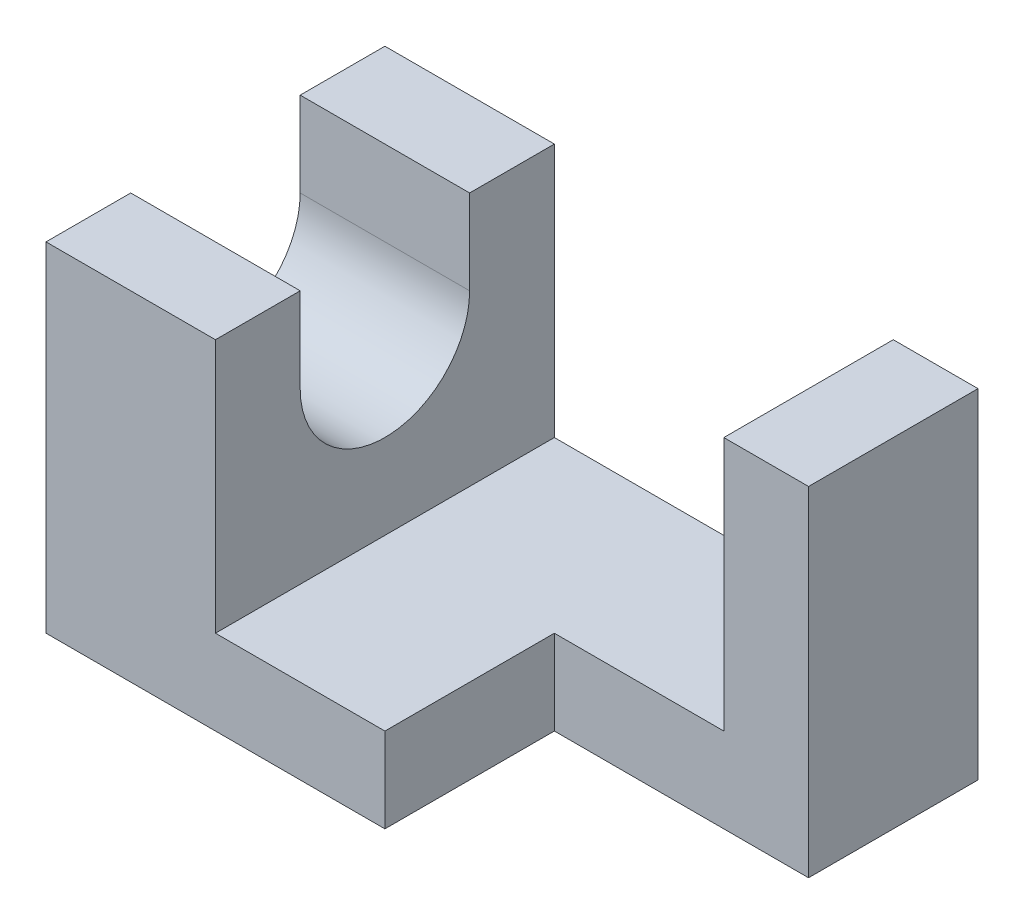
ISO-10303-21;
HEADER;
FILE_DESCRIPTION(('STEP AP214'),'2;1');
FILE_NAME('part.step','',(''),(''),'','','');
FILE_SCHEMA(('AUTOMOTIVE_DESIGN { 1 0 10303 214 1 1 1 1 }'));
ENDSEC;
DATA;
#1=APPLICATION_CONTEXT('core data for automotive mechanical design processes');
#2=APPLICATION_PROTOCOL_DEFINITION('international standard','automotive_design',2000,#1);
#3=PRODUCT_CONTEXT('',#1,'mechanical');
#4=PRODUCT('Part','Part','',(#3));
#5=PRODUCT_RELATED_PRODUCT_CATEGORY('part','',(#4));
#6=PRODUCT_DEFINITION_FORMATION('','',#4);
#7=PRODUCT_DEFINITION_CONTEXT('part definition',#1,'design');
#8=PRODUCT_DEFINITION('design','',#6,#7);
#9=PRODUCT_DEFINITION_SHAPE('','',#8);
#10=(LENGTH_UNIT() NAMED_UNIT(*) SI_UNIT(.MILLI.,.METRE.));
#11=(NAMED_UNIT(*) PLANE_ANGLE_UNIT() SI_UNIT($,.RADIAN.));
#12=(NAMED_UNIT(*) SI_UNIT($,.STERADIAN.) SOLID_ANGLE_UNIT());
#13=UNCERTAINTY_MEASURE_WITH_UNIT(LENGTH_MEASURE(1.E-05),#10,'distance_accuracy_value','');
#14=(GEOMETRIC_REPRESENTATION_CONTEXT(3) GLOBAL_UNCERTAINTY_ASSIGNED_CONTEXT((#13)) GLOBAL_UNIT_ASSIGNED_CONTEXT((#10,
#11,#12)) REPRESENTATION_CONTEXT('',''));
#15=CARTESIAN_POINT('',(0.,0.,0.));
#16=DIRECTION('',(0.,0.,1.));
#17=DIRECTION('',(1.,0.,0.));
#18=AXIS2_PLACEMENT_3D('',#15,#16,#17);
#19=CARTESIAN_POINT('',(0.,40.,-40.));
#20=DIRECTION('',(0.,1.,0.));
#21=DIRECTION('',(0.,0.,1.));
#22=AXIS2_PLACEMENT_3D('',#19,#20,#21);
#23=PLANE('',#22);
#24=DIRECTION('',(-1.,0.,0.));
#25=VECTOR('',#24,1.);
#26=CARTESIAN_POINT('',(40.,40.,-10.));
#27=LINE('',#26,#25);
#28=CARTESIAN_POINT('',(20.,40.,-10.));
#29=VERTEX_POINT('',#28);
#30=CARTESIAN_POINT('',(0.,40.,-10.));
#31=VERTEX_POINT('',#30);
#32=EDGE_CURVE('E186',#29,#31,#27,.T.);
#33=ORIENTED_EDGE('',*,*,#32,.T.);
#34=DIRECTION('',(0.,0.,1.));
#35=VECTOR('',#34,1.);
#36=CARTESIAN_POINT('',(0.,40.,-40.));
#37=LINE('',#36,#35);
#38=CARTESIAN_POINT('',(0.,40.,0.));
#39=VERTEX_POINT('',#38);
#40=EDGE_CURVE('E158',#31,#39,#37,.T.);
#41=ORIENTED_EDGE('',*,*,#40,.T.);
#42=DIRECTION('',(-1.,0.,0.));
#43=VECTOR('',#42,1.);
#44=CARTESIAN_POINT('',(0.,40.,0.));
#45=LINE('',#44,#43);
#46=CARTESIAN_POINT('',(20.,40.,0.));
#47=VERTEX_POINT('',#46);
#48=EDGE_CURVE('E165',#47,#39,#45,.T.);
#49=ORIENTED_EDGE('',*,*,#48,.F.);
#50=DIRECTION('',(0.,0.,1.));
#51=VECTOR('',#50,1.);
#52=CARTESIAN_POINT('',(20.,40.,-40.));
#53=LINE('',#52,#51);
#54=EDGE_CURVE('E228',#29,#47,#53,.T.);
#55=ORIENTED_EDGE('',*,*,#54,.F.);
#56=EDGE_LOOP('',(#33,#41,#49,#55));
#57=FACE_BOUND('',#56,.T.);
#58=ADVANCED_FACE('F33',(#57),#23,.T.);
#59=DIRECTION('',(-1.,0.,0.));
#60=VECTOR('',#59,1.);
#61=CARTESIAN_POINT('',(40.,40.,-30.));
#62=LINE('',#61,#60);
#63=CARTESIAN_POINT('',(20.,40.,-30.));
#64=VERTEX_POINT('',#63);
#65=CARTESIAN_POINT('',(0.,40.,-30.));
#66=VERTEX_POINT('',#65);
#67=EDGE_CURVE('E132',#64,#66,#62,.T.);
#68=ORIENTED_EDGE('',*,*,#67,.F.);
#69=CARTESIAN_POINT('',(20.,40.,-40.));
#70=VERTEX_POINT('',#69);
#71=EDGE_CURVE('E225',#70,#64,#53,.T.);
#72=ORIENTED_EDGE('',*,*,#71,.F.);
#73=DIRECTION('',(-1.,0.,0.));
#74=VECTOR('',#73,1.);
#75=CARTESIAN_POINT('',(0.,40.,-40.));
#76=LINE('',#75,#74);
#77=CARTESIAN_POINT('',(0.,40.,-40.));
#78=VERTEX_POINT('',#77);
#79=EDGE_CURVE('E156',#70,#78,#76,.T.);
#80=ORIENTED_EDGE('',*,*,#79,.T.);
#81=EDGE_CURVE('E149',#78,#66,#37,.T.);
#82=ORIENTED_EDGE('',*,*,#81,.T.);
#83=EDGE_LOOP('',(#68,#72,#80,#82));
#84=FACE_BOUND('',#83,.T.);
#85=ADVANCED_FACE('F154',(#84),#23,.T.);
#86=CARTESIAN_POINT('',(0.,0.,-40.));
#87=DIRECTION('',(-1.,0.,0.));
#88=DIRECTION('',(0.,-1.,0.));
#89=AXIS2_PLACEMENT_3D('',#86,#87,#88);
#90=PLANE('',#89);
#91=DIRECTION('',(0.,1.,0.));
#92=VECTOR('',#91,1.);
#93=CARTESIAN_POINT('',(0.,30.,-10.));
#94=LINE('',#93,#92);
#95=CARTESIAN_POINT('',(0.,30.,-10.));
#96=VERTEX_POINT('',#95);
#97=EDGE_CURVE('E143',#96,#31,#94,.T.);
#98=ORIENTED_EDGE('',*,*,#97,.F.);
#99=CARTESIAN_POINT('',(0.,30.,-20.));
#100=DIRECTION('',(-1.,0.,0.));
#101=DIRECTION('',(0.,-1.,0.));
#102=AXIS2_PLACEMENT_3D('',#99,#100,#101);
#103=CIRCLE('',#102,10.);
#104=CARTESIAN_POINT('',(0.,30.,-30.));
#105=VERTEX_POINT('',#104);
#106=EDGE_CURVE('E152',#105,#96,#103,.T.);
#107=ORIENTED_EDGE('',*,*,#106,.F.);
#108=DIRECTION('',(0.,-1.,0.));
#109=VECTOR('',#108,1.);
#110=CARTESIAN_POINT('',(0.,40.,-30.));
#111=LINE('',#110,#109);
#112=EDGE_CURVE('E135',#66,#105,#111,.T.);
#113=ORIENTED_EDGE('',*,*,#112,.F.);
#114=ORIENTED_EDGE('',*,*,#81,.F.);
#115=DIRECTION('',(0.,-1.,0.));
#116=VECTOR('',#115,1.);
#117=CARTESIAN_POINT('',(0.,0.,-40.));
#118=LINE('',#117,#116);
#119=CARTESIAN_POINT('',(0.,0.,-40.));
#120=VERTEX_POINT('',#119);
#121=EDGE_CURVE('E237',#78,#120,#118,.T.);
#122=ORIENTED_EDGE('',*,*,#121,.T.);
#123=DIRECTION('',(0.,0.,1.));
#124=VECTOR('',#123,1.);
#125=CARTESIAN_POINT('',(0.,0.,-40.));
#126=LINE('',#125,#124);
#127=CARTESIAN_POINT('',(0.,0.,0.));
#128=VERTEX_POINT('',#127);
#129=EDGE_CURVE('E172',#120,#128,#126,.T.);
#130=ORIENTED_EDGE('',*,*,#129,.T.);
#131=DIRECTION('',(0.,-1.,0.));
#132=VECTOR('',#131,1.);
#133=CARTESIAN_POINT('',(0.,0.,0.));
#134=LINE('',#133,#132);
#135=EDGE_CURVE('E227',#39,#128,#134,.T.);
#136=ORIENTED_EDGE('',*,*,#135,.F.);
#137=ORIENTED_EDGE('',*,*,#40,.F.);
#138=EDGE_LOOP('',(#98,#107,#113,#114,#122,#130,#136,#137));
#139=FACE_BOUND('',#138,.T.);
#140=ADVANCED_FACE('F35',(#139),#90,.T.);
#141=DIRECTION('',(-1.,0.,0.));
#142=VECTOR('',#141,1.);
#143=CARTESIAN_POINT('',(70.,40.,-20.));
#144=LINE('',#143,#142);
#145=CARTESIAN_POINT('',(70.,40.,-20.));
#146=VERTEX_POINT('',#145);
#147=CARTESIAN_POINT('',(60.,40.,-20.));
#148=VERTEX_POINT('',#147);
#149=EDGE_CURVE('E189',#146,#148,#144,.T.);
#150=ORIENTED_EDGE('',*,*,#149,.F.);
#151=DIRECTION('',(0.,0.,1.));
#152=VECTOR('',#151,1.);
#153=CARTESIAN_POINT('',(70.,40.,-40.));
#154=LINE('',#153,#152);
#155=CARTESIAN_POINT('',(70.,40.,-40.));
#156=VERTEX_POINT('',#155);
#157=EDGE_CURVE('E162',#156,#146,#154,.T.);
#158=ORIENTED_EDGE('',*,*,#157,.F.);
#159=CARTESIAN_POINT('',(60.,40.,-40.));
#160=VERTEX_POINT('',#159);
#161=EDGE_CURVE('E173',#156,#160,#76,.T.);
#162=ORIENTED_EDGE('',*,*,#161,.T.);
#163=DIRECTION('',(0.,0.,1.));
#164=VECTOR('',#163,1.);
#165=CARTESIAN_POINT('',(60.,40.,-40.));
#166=LINE('',#165,#164);
#167=EDGE_CURVE('E229',#160,#148,#166,.T.);
#168=ORIENTED_EDGE('',*,*,#167,.T.);
#169=EDGE_LOOP('',(#150,#158,#162,#168));
#170=FACE_BOUND('',#169,.T.);
#171=ADVANCED_FACE('F282',(#170),#23,.T.);
#172=CARTESIAN_POINT('',(70.,0.,-40.));
#173=DIRECTION('',(1.,0.,0.));
#174=DIRECTION('',(0.,1.,0.));
#175=AXIS2_PLACEMENT_3D('',#172,#173,#174);
#176=PLANE('',#175);
#177=DIRECTION('',(0.,1.,0.));
#178=VECTOR('',#177,1.);
#179=CARTESIAN_POINT('',(70.,0.,-20.));
#180=LINE('',#179,#178);
#181=CARTESIAN_POINT('',(70.,0.,-20.));
#182=VERTEX_POINT('',#181);
#183=EDGE_CURVE('E200',#182,#146,#180,.T.);
#184=ORIENTED_EDGE('',*,*,#183,.F.);
#185=DIRECTION('',(0.,0.,1.));
#186=VECTOR('',#185,1.);
#187=CARTESIAN_POINT('',(70.,0.,-40.));
#188=LINE('',#187,#186);
#189=CARTESIAN_POINT('',(70.,0.,-40.));
#190=VERTEX_POINT('',#189);
#191=EDGE_CURVE('E169',#190,#182,#188,.T.);
#192=ORIENTED_EDGE('',*,*,#191,.F.);
#193=DIRECTION('',(0.,1.,0.));
#194=VECTOR('',#193,1.);
#195=CARTESIAN_POINT('',(70.,0.,-40.));
#196=LINE('',#195,#194);
#197=EDGE_CURVE('E242',#190,#156,#196,.T.);
#198=ORIENTED_EDGE('',*,*,#197,.T.);
#199=ORIENTED_EDGE('',*,*,#157,.T.);
#200=EDGE_LOOP('',(#184,#192,#198,#199));
#201=FACE_BOUND('',#200,.T.);
#202=ADVANCED_FACE('F289',(#201),#176,.T.);
#203=CARTESIAN_POINT('',(0.,0.,-40.));
#204=DIRECTION('',(0.,-1.,0.));
#205=DIRECTION('',(0.,0.,-1.));
#206=AXIS2_PLACEMENT_3D('',#203,#204,#205);
#207=PLANE('',#206);
#208=DIRECTION('',(0.,0.,1.));
#209=VECTOR('',#208,1.);
#210=CARTESIAN_POINT('',(40.,0.,0.));
#211=LINE('',#210,#209);
#212=CARTESIAN_POINT('',(40.,0.,-20.));
#213=VERTEX_POINT('',#212);
#214=CARTESIAN_POINT('',(40.,0.,0.));
#215=VERTEX_POINT('',#214);
#216=EDGE_CURVE('E197',#213,#215,#211,.T.);
#217=ORIENTED_EDGE('',*,*,#216,.T.);
#218=DIRECTION('',(1.,0.,0.));
#219=VECTOR('',#218,1.);
#220=CARTESIAN_POINT('',(0.,0.,0.));
#221=LINE('',#220,#219);
#222=EDGE_CURVE('E248',#128,#215,#221,.T.);
#223=ORIENTED_EDGE('',*,*,#222,.F.);
#224=ORIENTED_EDGE('',*,*,#129,.F.);
#225=DIRECTION('',(1.,0.,0.));
#226=VECTOR('',#225,1.);
#227=CARTESIAN_POINT('',(0.,0.,-40.));
#228=LINE('',#227,#226);
#229=EDGE_CURVE('E239',#120,#190,#228,.T.);
#230=ORIENTED_EDGE('',*,*,#229,.T.);
#231=ORIENTED_EDGE('',*,*,#191,.T.);
#232=DIRECTION('',(-1.,0.,0.));
#233=VECTOR('',#232,1.);
#234=CARTESIAN_POINT('',(70.,0.,-20.));
#235=LINE('',#234,#233);
#236=EDGE_CURVE('E194',#182,#213,#235,.T.);
#237=ORIENTED_EDGE('',*,*,#236,.T.);
#238=EDGE_LOOP('',(#217,#223,#224,#230,#231,#237));
#239=FACE_BOUND('',#238,.T.);
#240=ADVANCED_FACE('F262',(#239),#207,.T.);
#241=CARTESIAN_POINT('',(0.,0.,-40.));
#242=DIRECTION('',(0.,0.,-1.));
#243=DIRECTION('',(-1.,0.,0.));
#244=AXIS2_PLACEMENT_3D('',#241,#242,#243);
#245=PLANE('',#244);
#246=DIRECTION('',(0.,-1.,0.));
#247=VECTOR('',#246,1.);
#248=CARTESIAN_POINT('',(20.,40.,-40.));
#249=LINE('',#248,#247);
#250=CARTESIAN_POINT('',(20.,10.,-40.));
#251=VERTEX_POINT('',#250);
#252=EDGE_CURVE('E211',#70,#251,#249,.T.);
#253=ORIENTED_EDGE('',*,*,#252,.T.);
#254=DIRECTION('',(1.,0.,0.));
#255=VECTOR('',#254,1.);
#256=CARTESIAN_POINT('',(20.,10.,-40.));
#257=LINE('',#256,#255);
#258=CARTESIAN_POINT('',(60.,10.,-40.));
#259=VERTEX_POINT('',#258);
#260=EDGE_CURVE('E214',#251,#259,#257,.T.);
#261=ORIENTED_EDGE('',*,*,#260,.T.);
#262=DIRECTION('',(0.,1.,0.));
#263=VECTOR('',#262,1.);
#264=CARTESIAN_POINT('',(60.,40.,-40.));
#265=LINE('',#264,#263);
#266=EDGE_CURVE('E218',#259,#160,#265,.T.);
#267=ORIENTED_EDGE('',*,*,#266,.T.);
#268=ORIENTED_EDGE('',*,*,#161,.F.);
#269=ORIENTED_EDGE('',*,*,#197,.F.);
#270=ORIENTED_EDGE('',*,*,#229,.F.);
#271=ORIENTED_EDGE('',*,*,#121,.F.);
#272=ORIENTED_EDGE('',*,*,#79,.F.);
#273=EDGE_LOOP('',(#253,#261,#267,#268,#269,#270,#271,#272));
#274=FACE_BOUND('',#273,.T.);
#275=ADVANCED_FACE('F301',(#274),#245,.T.);
#276=CARTESIAN_POINT('',(0.,0.,0.));
#277=DIRECTION('',(0.,0.,-1.));
#278=DIRECTION('',(-1.,0.,0.));
#279=AXIS2_PLACEMENT_3D('',#276,#277,#278);
#280=PLANE('',#279);
#281=ORIENTED_EDGE('',*,*,#222,.T.);
#282=DIRECTION('',(0.,1.,0.));
#283=VECTOR('',#282,1.);
#284=CARTESIAN_POINT('',(40.,0.,0.));
#285=LINE('',#284,#283);
#286=CARTESIAN_POINT('',(40.,10.,0.));
#287=VERTEX_POINT('',#286);
#288=EDGE_CURVE('E202',#215,#287,#285,.T.);
#289=ORIENTED_EDGE('',*,*,#288,.T.);
#290=DIRECTION('',(1.,0.,0.));
#291=VECTOR('',#290,1.);
#292=CARTESIAN_POINT('',(20.,10.,0.));
#293=LINE('',#292,#291);
#294=CARTESIAN_POINT('',(20.,10.,0.));
#295=VERTEX_POINT('',#294);
#296=EDGE_CURVE('E215',#295,#287,#293,.T.);
#297=ORIENTED_EDGE('',*,*,#296,.F.);
#298=DIRECTION('',(0.,-1.,0.));
#299=VECTOR('',#298,1.);
#300=CARTESIAN_POINT('',(20.,40.,0.));
#301=LINE('',#300,#299);
#302=EDGE_CURVE('E210',#47,#295,#301,.T.);
#303=ORIENTED_EDGE('',*,*,#302,.F.);
#304=ORIENTED_EDGE('',*,*,#48,.T.);
#305=ORIENTED_EDGE('',*,*,#135,.T.);
#306=EDGE_LOOP('',(#281,#289,#297,#303,#304,#305));
#307=FACE_BOUND('',#306,.T.);
#308=ADVANCED_FACE('F256',(#307),#280,.F.);
#309=CARTESIAN_POINT('',(20.,40.,-40.));
#310=DIRECTION('',(-1.,0.,0.));
#311=DIRECTION('',(0.,0.,1.));
#312=AXIS2_PLACEMENT_3D('',#309,#310,#311);
#313=PLANE('',#312);
#314=CARTESIAN_POINT('',(20.,30.,-20.));
#315=DIRECTION('',(-1.,0.,0.));
#316=DIRECTION('',(0.,0.,1.));
#317=AXIS2_PLACEMENT_3D('',#314,#315,#316);
#318=CIRCLE('',#317,10.);
#319=CARTESIAN_POINT('',(20.,30.,-30.));
#320=VERTEX_POINT('',#319);
#321=CARTESIAN_POINT('',(20.,30.,-10.));
#322=VERTEX_POINT('',#321);
#323=EDGE_CURVE('E41',#320,#322,#318,.T.);
#324=ORIENTED_EDGE('',*,*,#323,.T.);
#325=DIRECTION('',(0.,1.,0.));
#326=VECTOR('',#325,1.);
#327=CARTESIAN_POINT('',(20.,40.,-10.));
#328=LINE('',#327,#326);
#329=EDGE_CURVE('E11',#322,#29,#328,.T.);
#330=ORIENTED_EDGE('',*,*,#329,.T.);
#331=ORIENTED_EDGE('',*,*,#54,.T.);
#332=ORIENTED_EDGE('',*,*,#302,.T.);
#333=DIRECTION('',(0.,0.,1.));
#334=VECTOR('',#333,1.);
#335=CARTESIAN_POINT('',(20.,10.,-40.));
#336=LINE('',#335,#334);
#337=EDGE_CURVE('E221',#251,#295,#336,.T.);
#338=ORIENTED_EDGE('',*,*,#337,.F.);
#339=ORIENTED_EDGE('',*,*,#252,.F.);
#340=ORIENTED_EDGE('',*,*,#71,.T.);
#341=DIRECTION('',(0.,-1.,0.));
#342=VECTOR('',#341,1.);
#343=CARTESIAN_POINT('',(20.,40.,-30.));
#344=LINE('',#343,#342);
#345=EDGE_CURVE('E138',#64,#320,#344,.T.);
#346=ORIENTED_EDGE('',*,*,#345,.T.);
#347=EDGE_LOOP('',(#324,#330,#331,#332,#338,#339,#340,#346));
#348=FACE_BOUND('',#347,.T.);
#349=ADVANCED_FACE('F179',(#348),#313,.F.);
#350=CARTESIAN_POINT('',(60.,40.,-40.));
#351=DIRECTION('',(1.,0.,0.));
#352=DIRECTION('',(0.,0.,-1.));
#353=AXIS2_PLACEMENT_3D('',#350,#351,#352);
#354=PLANE('',#353);
#355=DIRECTION('',(0.,0.,1.));
#356=VECTOR('',#355,1.);
#357=CARTESIAN_POINT('',(60.,10.,-40.));
#358=LINE('',#357,#356);
#359=CARTESIAN_POINT('',(60.,10.,-20.));
#360=VERTEX_POINT('',#359);
#361=EDGE_CURVE('E232',#259,#360,#358,.T.);
#362=ORIENTED_EDGE('',*,*,#361,.T.);
#363=DIRECTION('',(0.,1.,0.));
#364=VECTOR('',#363,1.);
#365=CARTESIAN_POINT('',(60.,40.,-20.));
#366=LINE('',#365,#364);
#367=EDGE_CURVE('E56',#360,#148,#366,.T.);
#368=ORIENTED_EDGE('',*,*,#367,.T.);
#369=ORIENTED_EDGE('',*,*,#167,.F.);
#370=ORIENTED_EDGE('',*,*,#266,.F.);
#371=EDGE_LOOP('',(#362,#368,#369,#370));
#372=FACE_BOUND('',#371,.T.);
#373=ADVANCED_FACE('F304',(#372),#354,.F.);
#374=CARTESIAN_POINT('',(20.,10.,-40.));
#375=DIRECTION('',(0.,-1.,0.));
#376=DIRECTION('',(0.,0.,-1.));
#377=AXIS2_PLACEMENT_3D('',#374,#375,#376);
#378=PLANE('',#377);
#379=ORIENTED_EDGE('',*,*,#296,.T.);
#380=DIRECTION('',(0.,0.,-1.));
#381=VECTOR('',#380,1.);
#382=CARTESIAN_POINT('',(40.,10.,-40.));
#383=LINE('',#382,#381);
#384=CARTESIAN_POINT('',(40.,10.,-20.));
#385=VERTEX_POINT('',#384);
#386=EDGE_CURVE('E160',#287,#385,#383,.T.);
#387=ORIENTED_EDGE('',*,*,#386,.T.);
#388=DIRECTION('',(1.,0.,0.));
#389=VECTOR('',#388,1.);
#390=CARTESIAN_POINT('',(20.,10.,-20.));
#391=LINE('',#390,#389);
#392=EDGE_CURVE('E157',#385,#360,#391,.T.);
#393=ORIENTED_EDGE('',*,*,#392,.T.);
#394=ORIENTED_EDGE('',*,*,#361,.F.);
#395=ORIENTED_EDGE('',*,*,#260,.F.);
#396=ORIENTED_EDGE('',*,*,#337,.T.);
#397=EDGE_LOOP('',(#379,#387,#393,#394,#395,#396));
#398=FACE_BOUND('',#397,.T.);
#399=ADVANCED_FACE('F267',(#398),#378,.F.);
#400=CARTESIAN_POINT('',(40.,0.,0.));
#401=DIRECTION('',(-1.,0.,0.));
#402=DIRECTION('',(0.,0.,1.));
#403=AXIS2_PLACEMENT_3D('',#400,#401,#402);
#404=PLANE('',#403);
#405=ORIENTED_EDGE('',*,*,#288,.F.);
#406=ORIENTED_EDGE('',*,*,#216,.F.);
#407=DIRECTION('',(0.,1.,0.));
#408=VECTOR('',#407,1.);
#409=CARTESIAN_POINT('',(40.,0.,-20.));
#410=LINE('',#409,#408);
#411=EDGE_CURVE('E205',#213,#385,#410,.T.);
#412=ORIENTED_EDGE('',*,*,#411,.T.);
#413=ORIENTED_EDGE('',*,*,#386,.F.);
#414=EDGE_LOOP('',(#405,#406,#412,#413));
#415=FACE_BOUND('',#414,.T.);
#416=ADVANCED_FACE('F265',(#415),#404,.F.);
#417=CARTESIAN_POINT('',(70.,0.,-20.));
#418=DIRECTION('',(0.,0.,-1.));
#419=DIRECTION('',(-1.,0.,0.));
#420=AXIS2_PLACEMENT_3D('',#417,#418,#419);
#421=PLANE('',#420);
#422=ORIENTED_EDGE('',*,*,#392,.F.);
#423=ORIENTED_EDGE('',*,*,#411,.F.);
#424=ORIENTED_EDGE('',*,*,#236,.F.);
#425=ORIENTED_EDGE('',*,*,#183,.T.);
#426=ORIENTED_EDGE('',*,*,#149,.T.);
#427=ORIENTED_EDGE('',*,*,#367,.F.);
#428=EDGE_LOOP('',(#422,#423,#424,#425,#426,#427));
#429=FACE_BOUND('',#428,.T.);
#430=ADVANCED_FACE('F272',(#429),#421,.F.);
#431=CARTESIAN_POINT('',(40.,30.,-10.));
#432=DIRECTION('',(0.,0.,1.));
#433=DIRECTION('',(1.,0.,0.));
#434=AXIS2_PLACEMENT_3D('',#431,#432,#433);
#435=PLANE('',#434);
#436=DIRECTION('',(-1.,0.,0.));
#437=VECTOR('',#436,1.);
#438=CARTESIAN_POINT('',(40.,30.,-10.));
#439=LINE('',#438,#437);
#440=EDGE_CURVE('E184',#322,#96,#439,.T.);
#441=ORIENTED_EDGE('',*,*,#440,.T.);
#442=ORIENTED_EDGE('',*,*,#97,.T.);
#443=ORIENTED_EDGE('',*,*,#32,.F.);
#444=ORIENTED_EDGE('',*,*,#329,.F.);
#445=EDGE_LOOP('',(#441,#442,#443,#444));
#446=FACE_BOUND('',#445,.T.);
#447=ADVANCED_FACE('F269',(#446),#435,.F.);
#448=CARTESIAN_POINT('',(40.,30.,-20.));
#449=DIRECTION('',(-1.,0.,0.));
#450=DIRECTION('',(0.,-1.,0.));
#451=AXIS2_PLACEMENT_3D('',#448,#449,#450);
#452=CYLINDRICAL_SURFACE('',#451,10.);
#453=DIRECTION('',(-1.,0.,0.));
#454=VECTOR('',#453,1.);
#455=CARTESIAN_POINT('',(40.,30.,-30.));
#456=LINE('',#455,#454);
#457=EDGE_CURVE('E48',#320,#105,#456,.T.);
#458=ORIENTED_EDGE('',*,*,#457,.T.);
#459=ORIENTED_EDGE('',*,*,#106,.T.);
#460=ORIENTED_EDGE('',*,*,#440,.F.);
#461=ORIENTED_EDGE('',*,*,#323,.F.);
#462=EDGE_LOOP('',(#458,#459,#460,#461));
#463=FACE_BOUND('',#462,.T.);
#464=ADVANCED_FACE('F183',(#463),#452,.F.);
#465=CARTESIAN_POINT('',(40.,40.,-30.));
#466=DIRECTION('',(0.,0.,-1.));
#467=DIRECTION('',(0.,1.,0.));
#468=AXIS2_PLACEMENT_3D('',#465,#466,#467);
#469=PLANE('',#468);
#470=ORIENTED_EDGE('',*,*,#67,.T.);
#471=ORIENTED_EDGE('',*,*,#112,.T.);
#472=ORIENTED_EDGE('',*,*,#457,.F.);
#473=ORIENTED_EDGE('',*,*,#345,.F.);
#474=EDGE_LOOP('',(#470,#471,#472,#473));
#475=FACE_BOUND('',#474,.T.);
#476=ADVANCED_FACE('F134',(#475),#469,.F.);
#477=CLOSED_SHELL('',(#58,#85,#140,#171,#202,#240,#275,#308,#349,#373,#399,#416,#430,#447,#464,#476));
#478=MANIFOLD_SOLID_BREP('B2',#477);
#479=ADVANCED_BREP_SHAPE_REPRESENTATION('',(#18,#478),#14);
#480=SHAPE_DEFINITION_REPRESENTATION(#9,#479);
ENDSEC;
END-ISO-10303-21;
